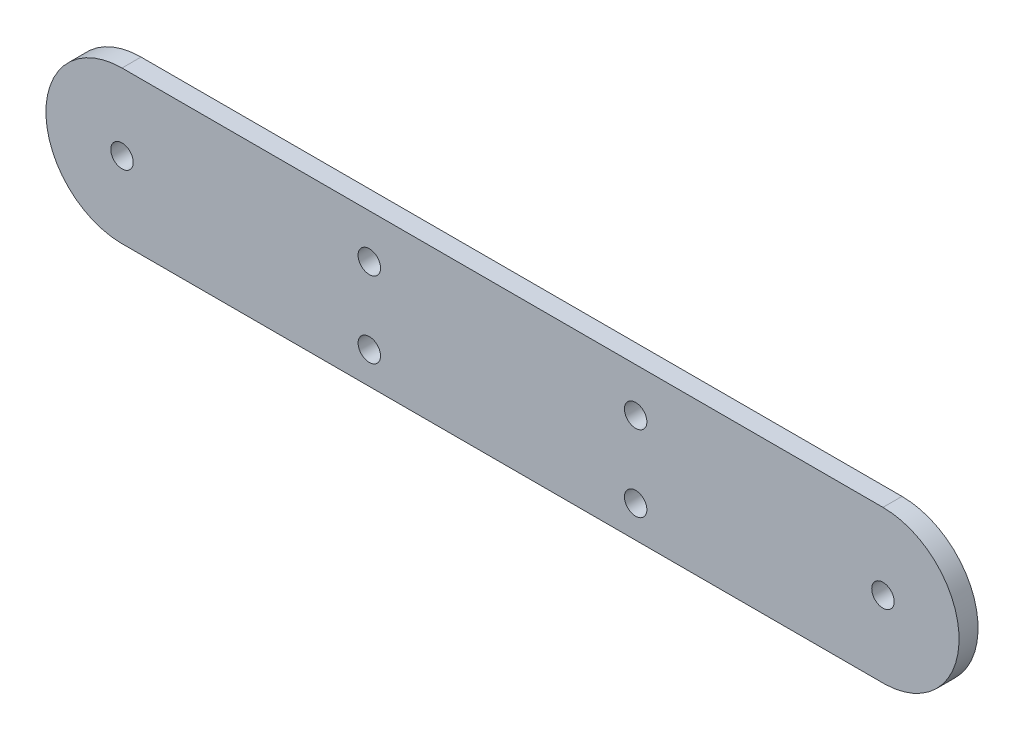
ISO-10303-21;
HEADER;
FILE_DESCRIPTION(('STEP AP214'),'2;1');
FILE_NAME('part.step','',(''),(''),'','','');
FILE_SCHEMA(('AUTOMOTIVE_DESIGN { 1 0 10303 214 1 1 1 1 }'));
ENDSEC;
DATA;
#1=APPLICATION_CONTEXT('core data for automotive mechanical design processes');
#2=APPLICATION_PROTOCOL_DEFINITION('international standard','automotive_design',2000,#1);
#3=PRODUCT_CONTEXT('',#1,'mechanical');
#4=PRODUCT('Part','Part','',(#3));
#5=PRODUCT_RELATED_PRODUCT_CATEGORY('part','',(#4));
#6=PRODUCT_DEFINITION_FORMATION('','',#4);
#7=PRODUCT_DEFINITION_CONTEXT('part definition',#1,'design');
#8=PRODUCT_DEFINITION('design','',#6,#7);
#9=PRODUCT_DEFINITION_SHAPE('','',#8);
#10=(LENGTH_UNIT() NAMED_UNIT(*) SI_UNIT(.MILLI.,.METRE.));
#11=(NAMED_UNIT(*) PLANE_ANGLE_UNIT() SI_UNIT($,.RADIAN.));
#12=(NAMED_UNIT(*) SI_UNIT($,.STERADIAN.) SOLID_ANGLE_UNIT());
#13=UNCERTAINTY_MEASURE_WITH_UNIT(LENGTH_MEASURE(1.E-05),#10,'distance_accuracy_value','');
#14=(GEOMETRIC_REPRESENTATION_CONTEXT(3) GLOBAL_UNCERTAINTY_ASSIGNED_CONTEXT((#13)) GLOBAL_UNIT_ASSIGNED_CONTEXT((#10,
#11,#12)) REPRESENTATION_CONTEXT('',''));
#15=CARTESIAN_POINT('',(0.,0.,0.));
#16=DIRECTION('',(0.,0.,1.));
#17=DIRECTION('',(1.,0.,0.));
#18=AXIS2_PLACEMENT_3D('',#15,#16,#17);
#19=CARTESIAN_POINT('',(-99.9998638918776,1.57181808007131,2.5));
#20=DIRECTION('',(0.,0.,-1.));
#21=DIRECTION('',(-1.,0.,0.));
#22=AXIS2_PLACEMENT_3D('',#19,#20,#21);
#23=CYLINDRICAL_SURFACE('',#22,20.);
#24=CARTESIAN_POINT('',(-99.9998638918776,1.57181808007131,-2.5));
#25=DIRECTION('',(0.,0.,1.));
#26=DIRECTION('',(-1.,0.,0.));
#27=AXIS2_PLACEMENT_3D('',#24,#25,#26);
#28=CIRCLE('',#27,20.);
#29=CARTESIAN_POINT('',(-100.,21.5718180796082,-2.5));
#30=VERTEX_POINT('',#29);
#31=CARTESIAN_POINT('',(-100.628572724151,-18.4182976075435,-2.5));
#32=VERTEX_POINT('',#31);
#33=EDGE_CURVE('E98',#30,#32,#28,.T.);
#34=ORIENTED_EDGE('',*,*,#33,.T.);
#35=DIRECTION('',(0.,0.,-1.));
#36=VECTOR('',#35,1.);
#37=CARTESIAN_POINT('',(-100.628572724151,-18.4182976075435,2.5));
#38=LINE('',#37,#36);
#39=CARTESIAN_POINT('',(-100.628572724151,-18.4182976075435,2.5));
#40=VERTEX_POINT('',#39);
#41=EDGE_CURVE('E11',#40,#32,#38,.T.);
#42=ORIENTED_EDGE('',*,*,#41,.F.);
#43=CARTESIAN_POINT('',(-99.9998638918776,1.57181808007131,2.5));
#44=DIRECTION('',(0.,0.,1.));
#45=DIRECTION('',(-1.,0.,0.));
#46=AXIS2_PLACEMENT_3D('',#43,#44,#45);
#47=CIRCLE('',#46,20.);
#48=CARTESIAN_POINT('',(-100.,21.5718180796082,2.5));
#49=VERTEX_POINT('',#48);
#50=EDGE_CURVE('E85',#49,#40,#47,.T.);
#51=ORIENTED_EDGE('',*,*,#50,.F.);
#52=DIRECTION('',(0.,0.,-1.));
#53=VECTOR('',#52,1.);
#54=CARTESIAN_POINT('',(-100.,21.5718180796082,2.5));
#55=LINE('',#54,#53);
#56=EDGE_CURVE('E94',#49,#30,#55,.T.);
#57=ORIENTED_EDGE('',*,*,#56,.T.);
#58=EDGE_LOOP('',(#34,#42,#51,#57));
#59=FACE_BOUND('',#58,.T.);
#60=ADVANCED_FACE('F32',(#59),#23,.T.);
#61=CARTESIAN_POINT('',(100.628572724151,-18.4182976075435,2.5));
#62=DIRECTION('',(0.,1.,0.));
#63=DIRECTION('',(0.,0.,1.));
#64=AXIS2_PLACEMENT_3D('',#61,#62,#63);
#65=PLANE('',#64);
#66=DIRECTION('',(1.,0.,0.));
#67=VECTOR('',#66,1.);
#68=CARTESIAN_POINT('',(100.628572724151,-18.4182976075435,-2.5));
#69=LINE('',#68,#67);
#70=CARTESIAN_POINT('',(100.628572724151,-18.4182976075435,-2.5));
#71=VERTEX_POINT('',#70);
#72=EDGE_CURVE('E89',#32,#71,#69,.T.);
#73=ORIENTED_EDGE('',*,*,#72,.T.);
#74=DIRECTION('',(0.,0.,-1.));
#75=VECTOR('',#74,1.);
#76=CARTESIAN_POINT('',(100.628572724151,-18.4182976075435,2.5));
#77=LINE('',#76,#75);
#78=CARTESIAN_POINT('',(100.628572724151,-18.4182976075435,2.5));
#79=VERTEX_POINT('',#78);
#80=EDGE_CURVE('E41',#79,#71,#77,.T.);
#81=ORIENTED_EDGE('',*,*,#80,.F.);
#82=DIRECTION('',(1.,0.,0.));
#83=VECTOR('',#82,1.);
#84=CARTESIAN_POINT('',(100.628572724151,-18.4182976075435,2.5));
#85=LINE('',#84,#83);
#86=EDGE_CURVE('E80',#40,#79,#85,.T.);
#87=ORIENTED_EDGE('',*,*,#86,.F.);
#88=ORIENTED_EDGE('',*,*,#41,.T.);
#89=EDGE_LOOP('',(#73,#81,#87,#88));
#90=FACE_BOUND('',#89,.T.);
#91=ADVANCED_FACE('F88',(#90),#65,.F.);
#92=CARTESIAN_POINT('',(99.9998638918776,1.57181808007131,2.5));
#93=DIRECTION('',(0.,0.,-1.));
#94=DIRECTION('',(-1.,0.,0.));
#95=AXIS2_PLACEMENT_3D('',#92,#93,#94);
#96=CYLINDRICAL_SURFACE('',#95,20.);
#97=CARTESIAN_POINT('',(99.9998638918776,1.57181808007131,-2.5));
#98=DIRECTION('',(0.,0.,1.));
#99=DIRECTION('',(1.,0.,0.));
#100=AXIS2_PLACEMENT_3D('',#97,#98,#99);
#101=CIRCLE('',#100,20.);
#102=CARTESIAN_POINT('',(100.,21.5718180796082,-2.5));
#103=VERTEX_POINT('',#102);
#104=EDGE_CURVE('E67',#71,#103,#101,.T.);
#105=ORIENTED_EDGE('',*,*,#104,.T.);
#106=DIRECTION('',(0.,0.,-1.));
#107=VECTOR('',#106,1.);
#108=CARTESIAN_POINT('',(100.,21.5718180796082,2.5));
#109=LINE('',#108,#107);
#110=CARTESIAN_POINT('',(100.,21.5718180796082,2.5));
#111=VERTEX_POINT('',#110);
#112=EDGE_CURVE('E90',#111,#103,#109,.T.);
#113=ORIENTED_EDGE('',*,*,#112,.F.);
#114=CARTESIAN_POINT('',(99.9998638918776,1.57181808007131,2.5));
#115=DIRECTION('',(0.,0.,1.));
#116=DIRECTION('',(1.,0.,0.));
#117=AXIS2_PLACEMENT_3D('',#114,#115,#116);
#118=CIRCLE('',#117,20.);
#119=EDGE_CURVE('E83',#79,#111,#118,.T.);
#120=ORIENTED_EDGE('',*,*,#119,.F.);
#121=ORIENTED_EDGE('',*,*,#80,.T.);
#122=EDGE_LOOP('',(#105,#113,#120,#121));
#123=FACE_BOUND('',#122,.T.);
#124=ADVANCED_FACE('F92',(#123),#96,.T.);
#125=CARTESIAN_POINT('',(100.,21.5718180796082,2.5));
#126=DIRECTION('',(0.,-1.,0.));
#127=DIRECTION('',(1.,0.,0.));
#128=AXIS2_PLACEMENT_3D('',#125,#126,#127);
#129=PLANE('',#128);
#130=DIRECTION('',(-1.,0.,0.));
#131=VECTOR('',#130,1.);
#132=CARTESIAN_POINT('',(100.,21.5718180796082,-2.5));
#133=LINE('',#132,#131);
#134=EDGE_CURVE('E73',#103,#30,#133,.T.);
#135=ORIENTED_EDGE('',*,*,#134,.T.);
#136=ORIENTED_EDGE('',*,*,#56,.F.);
#137=DIRECTION('',(-1.,0.,0.));
#138=VECTOR('',#137,1.);
#139=CARTESIAN_POINT('',(100.,21.5718180796082,2.5));
#140=LINE('',#139,#138);
#141=EDGE_CURVE('E50',#111,#49,#140,.T.);
#142=ORIENTED_EDGE('',*,*,#141,.F.);
#143=ORIENTED_EDGE('',*,*,#112,.T.);
#144=EDGE_LOOP('',(#135,#136,#142,#143));
#145=FACE_BOUND('',#144,.T.);
#146=ADVANCED_FACE('F147',(#145),#129,.F.);
#147=CARTESIAN_POINT('',(-99.9998638918776,1.57181808007131,2.5));
#148=DIRECTION('',(0.,0.,-1.));
#149=DIRECTION('',(-1.,0.,0.));
#150=AXIS2_PLACEMENT_3D('',#147,#148,#149);
#151=PLANE('',#150);
#152=CARTESIAN_POINT('',(35.,9.99999999999999,2.5));
#153=DIRECTION('',(0.,0.,1.));
#154=DIRECTION('',(-1.,0.,0.));
#155=AXIS2_PLACEMENT_3D('',#152,#153,#154);
#156=CIRCLE('',#155,2.95);
#157=CARTESIAN_POINT('',(32.05,9.99999999999999,2.5));
#158=VERTEX_POINT('',#157);
#159=EDGE_CURVE('E133',#158,#158,#156,.T.);
#160=ORIENTED_EDGE('',*,*,#159,.F.);
#161=EDGE_LOOP('',(#160));
#162=FACE_BOUND('',#161,.T.);
#163=CARTESIAN_POINT('',(35.,-9.99999999999999,2.5));
#164=DIRECTION('',(0.,0.,1.));
#165=DIRECTION('',(1.,0.,0.));
#166=AXIS2_PLACEMENT_3D('',#163,#164,#165);
#167=CIRCLE('',#166,2.95000000000003);
#168=CARTESIAN_POINT('',(37.95,-9.99999999999999,2.5));
#169=VERTEX_POINT('',#168);
#170=EDGE_CURVE('E123',#169,#169,#167,.T.);
#171=ORIENTED_EDGE('',*,*,#170,.F.);
#172=EDGE_LOOP('',(#171));
#173=FACE_BOUND('',#172,.T.);
#174=CARTESIAN_POINT('',(-35.,-10.,2.5));
#175=DIRECTION('',(0.,0.,1.));
#176=DIRECTION('',(-1.,0.,0.));
#177=AXIS2_PLACEMENT_3D('',#174,#175,#176);
#178=CIRCLE('',#177,2.95000000000003);
#179=CARTESIAN_POINT('',(-37.95,-10.,2.5));
#180=VERTEX_POINT('',#179);
#181=EDGE_CURVE('E120',#180,#180,#178,.T.);
#182=ORIENTED_EDGE('',*,*,#181,.F.);
#183=EDGE_LOOP('',(#182));
#184=FACE_BOUND('',#183,.T.);
#185=CARTESIAN_POINT('',(-35.,10.,2.5));
#186=DIRECTION('',(0.,0.,1.));
#187=DIRECTION('',(1.,0.,0.));
#188=AXIS2_PLACEMENT_3D('',#185,#186,#187);
#189=CIRCLE('',#188,2.95);
#190=CARTESIAN_POINT('',(-32.05,10.,2.5));
#191=VERTEX_POINT('',#190);
#192=EDGE_CURVE('E117',#191,#191,#189,.T.);
#193=ORIENTED_EDGE('',*,*,#192,.F.);
#194=EDGE_LOOP('',(#193));
#195=FACE_BOUND('',#194,.T.);
#196=CARTESIAN_POINT('',(99.9998638918776,1.57181808007131,2.5));
#197=DIRECTION('',(0.,0.,1.));
#198=DIRECTION('',(-1.,0.,0.));
#199=AXIS2_PLACEMENT_3D('',#196,#197,#198);
#200=CIRCLE('',#199,2.95);
#201=CARTESIAN_POINT('',(97.0498638918776,1.57181808007131,2.5));
#202=VERTEX_POINT('',#201);
#203=EDGE_CURVE('E113',#202,#202,#200,.T.);
#204=ORIENTED_EDGE('',*,*,#203,.F.);
#205=EDGE_LOOP('',(#204));
#206=FACE_BOUND('',#205,.T.);
#207=CARTESIAN_POINT('',(-99.9998638918776,1.57181808007131,2.5));
#208=DIRECTION('',(0.,0.,1.));
#209=DIRECTION('',(1.,0.,0.));
#210=AXIS2_PLACEMENT_3D('',#207,#208,#209);
#211=CIRCLE('',#210,2.95);
#212=CARTESIAN_POINT('',(-97.0498638918776,1.57181808007131,2.5));
#213=VERTEX_POINT('',#212);
#214=EDGE_CURVE('E109',#213,#213,#211,.T.);
#215=ORIENTED_EDGE('',*,*,#214,.F.);
#216=EDGE_LOOP('',(#215));
#217=FACE_BOUND('',#216,.T.);
#218=ORIENTED_EDGE('',*,*,#50,.T.);
#219=ORIENTED_EDGE('',*,*,#86,.T.);
#220=ORIENTED_EDGE('',*,*,#119,.T.);
#221=ORIENTED_EDGE('',*,*,#141,.T.);
#222=EDGE_LOOP('',(#218,#219,#220,#221));
#223=FACE_BOUND('',#222,.T.);
#224=ADVANCED_FACE('F81',(#162,#173,#184,#195,#206,#217,#223),#151,.F.);
#225=CARTESIAN_POINT('',(-99.9998638918776,1.57181808007131,-2.5));
#226=DIRECTION('',(0.,0.,-1.));
#227=DIRECTION('',(-1.,0.,0.));
#228=AXIS2_PLACEMENT_3D('',#225,#226,#227);
#229=PLANE('',#228);
#230=CARTESIAN_POINT('',(35.,9.99999999999999,-2.5));
#231=DIRECTION('',(0.,0.,-1.));
#232=DIRECTION('',(-1.,0.,0.));
#233=AXIS2_PLACEMENT_3D('',#230,#231,#232);
#234=CIRCLE('',#233,2.95);
#235=CARTESIAN_POINT('',(32.05,9.99999999999999,-2.5));
#236=VERTEX_POINT('',#235);
#237=EDGE_CURVE('E35',#236,#236,#234,.T.);
#238=ORIENTED_EDGE('',*,*,#237,.F.);
#239=EDGE_LOOP('',(#238));
#240=FACE_BOUND('',#239,.T.);
#241=CARTESIAN_POINT('',(35.,-9.99999999999999,-2.5));
#242=DIRECTION('',(0.,0.,-1.));
#243=DIRECTION('',(-1.,0.,0.));
#244=AXIS2_PLACEMENT_3D('',#241,#242,#243);
#245=CIRCLE('',#244,2.95000000000003);
#246=CARTESIAN_POINT('',(32.05,-9.99999999999999,-2.5));
#247=VERTEX_POINT('',#246);
#248=EDGE_CURVE('E121',#247,#247,#245,.T.);
#249=ORIENTED_EDGE('',*,*,#248,.F.);
#250=EDGE_LOOP('',(#249));
#251=FACE_BOUND('',#250,.T.);
#252=CARTESIAN_POINT('',(-35.,-10.,-2.5));
#253=DIRECTION('',(0.,0.,-1.));
#254=DIRECTION('',(-1.,0.,0.));
#255=AXIS2_PLACEMENT_3D('',#252,#253,#254);
#256=CIRCLE('',#255,2.95000000000003);
#257=CARTESIAN_POINT('',(-37.95,-10.,-2.5));
#258=VERTEX_POINT('',#257);
#259=EDGE_CURVE('E118',#258,#258,#256,.T.);
#260=ORIENTED_EDGE('',*,*,#259,.F.);
#261=EDGE_LOOP('',(#260));
#262=FACE_BOUND('',#261,.T.);
#263=CARTESIAN_POINT('',(-35.,10.,-2.5));
#264=DIRECTION('',(0.,0.,-1.));
#265=DIRECTION('',(-1.,0.,0.));
#266=AXIS2_PLACEMENT_3D('',#263,#264,#265);
#267=CIRCLE('',#266,2.95);
#268=CARTESIAN_POINT('',(-37.95,10.,-2.5));
#269=VERTEX_POINT('',#268);
#270=EDGE_CURVE('E114',#269,#269,#267,.T.);
#271=ORIENTED_EDGE('',*,*,#270,.F.);
#272=EDGE_LOOP('',(#271));
#273=FACE_BOUND('',#272,.T.);
#274=CARTESIAN_POINT('',(99.9998638918776,1.57181808007131,-2.5));
#275=DIRECTION('',(0.,0.,-1.));
#276=DIRECTION('',(-1.,0.,0.));
#277=AXIS2_PLACEMENT_3D('',#274,#275,#276);
#278=CIRCLE('',#277,2.95);
#279=CARTESIAN_POINT('',(97.0498638918776,1.57181808007131,-2.5));
#280=VERTEX_POINT('',#279);
#281=EDGE_CURVE('E110',#280,#280,#278,.T.);
#282=ORIENTED_EDGE('',*,*,#281,.F.);
#283=EDGE_LOOP('',(#282));
#284=FACE_BOUND('',#283,.T.);
#285=CARTESIAN_POINT('',(-99.9998638918776,1.57181808007131,-2.5));
#286=DIRECTION('',(0.,0.,-1.));
#287=DIRECTION('',(-1.,0.,0.));
#288=AXIS2_PLACEMENT_3D('',#285,#286,#287);
#289=CIRCLE('',#288,2.95);
#290=CARTESIAN_POINT('',(-102.949863891878,1.57181808007131,-2.5));
#291=VERTEX_POINT('',#290);
#292=EDGE_CURVE('E101',#291,#291,#289,.T.);
#293=ORIENTED_EDGE('',*,*,#292,.F.);
#294=EDGE_LOOP('',(#293));
#295=FACE_BOUND('',#294,.T.);
#296=ORIENTED_EDGE('',*,*,#33,.F.);
#297=ORIENTED_EDGE('',*,*,#134,.F.);
#298=ORIENTED_EDGE('',*,*,#104,.F.);
#299=ORIENTED_EDGE('',*,*,#72,.F.);
#300=EDGE_LOOP('',(#296,#297,#298,#299));
#301=FACE_BOUND('',#300,.T.);
#302=ADVANCED_FACE('F146',(#240,#251,#262,#273,#284,#295,#301),#229,.T.);
#303=CARTESIAN_POINT('',(-99.9998638918776,1.57181808007131,-7.5));
#304=DIRECTION('',(0.,0.,1.));
#305=DIRECTION('',(1.,0.,0.));
#306=AXIS2_PLACEMENT_3D('',#303,#304,#305);
#307=CYLINDRICAL_SURFACE('',#306,2.95);
#308=ORIENTED_EDGE('',*,*,#292,.T.);
#309=EDGE_LOOP('',(#308));
#310=FACE_BOUND('',#309,.T.);
#311=ORIENTED_EDGE('',*,*,#214,.T.);
#312=EDGE_LOOP('',(#311));
#313=FACE_BOUND('',#312,.T.);
#314=ADVANCED_FACE('F143',(#310,#313),#307,.F.);
#315=CARTESIAN_POINT('',(99.9998638918776,1.57181808007131,-7.5));
#316=DIRECTION('',(0.,0.,1.));
#317=DIRECTION('',(1.,0.,0.));
#318=AXIS2_PLACEMENT_3D('',#315,#316,#317);
#319=CYLINDRICAL_SURFACE('',#318,2.95);
#320=ORIENTED_EDGE('',*,*,#281,.T.);
#321=EDGE_LOOP('',(#320));
#322=FACE_BOUND('',#321,.T.);
#323=ORIENTED_EDGE('',*,*,#203,.T.);
#324=EDGE_LOOP('',(#323));
#325=FACE_BOUND('',#324,.T.);
#326=ADVANCED_FACE('F187',(#322,#325),#319,.F.);
#327=CARTESIAN_POINT('',(-35.,10.,-7.5));
#328=DIRECTION('',(0.,0.,1.));
#329=DIRECTION('',(1.,0.,0.));
#330=AXIS2_PLACEMENT_3D('',#327,#328,#329);
#331=CYLINDRICAL_SURFACE('',#330,2.95);
#332=ORIENTED_EDGE('',*,*,#270,.T.);
#333=EDGE_LOOP('',(#332));
#334=FACE_BOUND('',#333,.T.);
#335=ORIENTED_EDGE('',*,*,#192,.T.);
#336=EDGE_LOOP('',(#335));
#337=FACE_BOUND('',#336,.T.);
#338=ADVANCED_FACE('F196',(#334,#337),#331,.F.);
#339=CARTESIAN_POINT('',(-35.,-10.,-7.5));
#340=DIRECTION('',(0.,0.,1.));
#341=DIRECTION('',(1.,0.,0.));
#342=AXIS2_PLACEMENT_3D('',#339,#340,#341);
#343=CYLINDRICAL_SURFACE('',#342,2.95000000000003);
#344=ORIENTED_EDGE('',*,*,#259,.T.);
#345=EDGE_LOOP('',(#344));
#346=FACE_BOUND('',#345,.T.);
#347=ORIENTED_EDGE('',*,*,#181,.T.);
#348=EDGE_LOOP('',(#347));
#349=FACE_BOUND('',#348,.T.);
#350=ADVANCED_FACE('F215',(#346,#349),#343,.F.);
#351=CARTESIAN_POINT('',(35.,-9.99999999999999,-7.5));
#352=DIRECTION('',(0.,0.,1.));
#353=DIRECTION('',(1.,0.,0.));
#354=AXIS2_PLACEMENT_3D('',#351,#352,#353);
#355=CYLINDRICAL_SURFACE('',#354,2.95000000000003);
#356=ORIENTED_EDGE('',*,*,#248,.T.);
#357=EDGE_LOOP('',(#356));
#358=FACE_BOUND('',#357,.T.);
#359=ORIENTED_EDGE('',*,*,#170,.T.);
#360=EDGE_LOOP('',(#359));
#361=FACE_BOUND('',#360,.T.);
#362=ADVANCED_FACE('F225',(#358,#361),#355,.F.);
#363=CARTESIAN_POINT('',(35.,9.99999999999999,-7.5));
#364=DIRECTION('',(0.,0.,1.));
#365=DIRECTION('',(1.,0.,0.));
#366=AXIS2_PLACEMENT_3D('',#363,#364,#365);
#367=CYLINDRICAL_SURFACE('',#366,2.95);
#368=ORIENTED_EDGE('',*,*,#237,.T.);
#369=EDGE_LOOP('',(#368));
#370=FACE_BOUND('',#369,.T.);
#371=ORIENTED_EDGE('',*,*,#159,.T.);
#372=EDGE_LOOP('',(#371));
#373=FACE_BOUND('',#372,.T.);
#374=ADVANCED_FACE('F235',(#370,#373),#367,.F.);
#375=CLOSED_SHELL('',(#60,#91,#124,#146,#224,#302,#314,#326,#338,#350,#362,#374));
#376=MANIFOLD_SOLID_BREP('B2',#375);
#377=ADVANCED_BREP_SHAPE_REPRESENTATION('',(#18,#376),#14);
#378=SHAPE_DEFINITION_REPRESENTATION(#9,#377);
ENDSEC;
END-ISO-10303-21;
